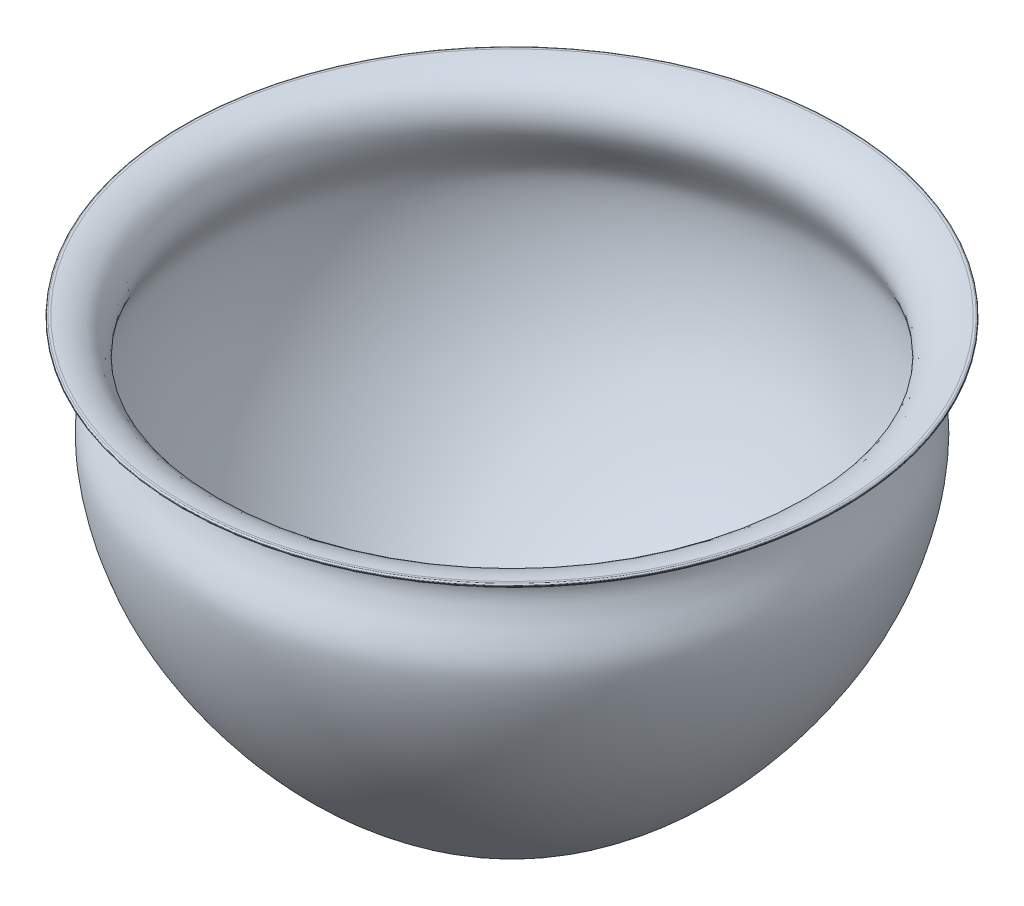
ISO-10303-21;
HEADER;
FILE_DESCRIPTION(('STEP AP214'),'2;1');
FILE_NAME('part.step','',(''),(''),'','','');
FILE_SCHEMA(('AUTOMOTIVE_DESIGN { 1 0 10303 214 1 1 1 1 }'));
ENDSEC;
DATA;
#1=APPLICATION_CONTEXT('core data for automotive mechanical design processes');
#2=APPLICATION_PROTOCOL_DEFINITION('international standard','automotive_design',2000,#1);
#3=PRODUCT_CONTEXT('',#1,'mechanical');
#4=PRODUCT('Part','Part','',(#3));
#5=PRODUCT_RELATED_PRODUCT_CATEGORY('part','',(#4));
#6=PRODUCT_DEFINITION_FORMATION('','',#4);
#7=PRODUCT_DEFINITION_CONTEXT('part definition',#1,'design');
#8=PRODUCT_DEFINITION('design','',#6,#7);
#9=PRODUCT_DEFINITION_SHAPE('','',#8);
#10=(LENGTH_UNIT() NAMED_UNIT(*) SI_UNIT(.MILLI.,.METRE.));
#11=(NAMED_UNIT(*) PLANE_ANGLE_UNIT() SI_UNIT($,.RADIAN.));
#12=(NAMED_UNIT(*) SI_UNIT($,.STERADIAN.) SOLID_ANGLE_UNIT());
#13=UNCERTAINTY_MEASURE_WITH_UNIT(LENGTH_MEASURE(1.E-05),#10,'distance_accuracy_value','');
#14=(GEOMETRIC_REPRESENTATION_CONTEXT(3) GLOBAL_UNCERTAINTY_ASSIGNED_CONTEXT((#13)) GLOBAL_UNIT_ASSIGNED_CONTEXT((#10,
#11,#12)) REPRESENTATION_CONTEXT('',''));
#15=CARTESIAN_POINT('',(0.,0.,0.));
#16=DIRECTION('',(0.,0.,1.));
#17=DIRECTION('',(1.,0.,0.));
#18=AXIS2_PLACEMENT_3D('',#15,#16,#17);
#19=CARTESIAN_POINT('',(0.,138.146661076661,0.));
#20=DIRECTION('',(0.,1.,0.));
#21=DIRECTION('',(0.,0.,1.));
#22=AXIS2_PLACEMENT_3D('',#19,#20,#21);
#23=CYLINDRICAL_SURFACE('',#22,196.85);
#24=CARTESIAN_POINT('',(0.,111.576447321761,0.));
#25=DIRECTION('',(0.,1.,0.));
#26=DIRECTION('',(0.,0.,1.));
#27=AXIS2_PLACEMENT_3D('',#24,#25,#26);
#28=CIRCLE('',#27,196.85);
#29=CARTESIAN_POINT('',(0.,111.576447321761,196.85));
#30=VERTEX_POINT('',#29);
#31=EDGE_CURVE('E46',#30,#30,#28,.F.);
#32=ORIENTED_EDGE('',*,*,#31,.T.);
#33=EDGE_LOOP('',(#32));
#34=FACE_BOUND('',#33,.T.);
#35=CARTESIAN_POINT('',(0.,111.140228763594,0.));
#36=DIRECTION('',(0.,-1.,0.));
#37=DIRECTION('',(0.,0.,-1.));
#38=AXIS2_PLACEMENT_3D('',#35,#36,#37);
#39=CIRCLE('',#38,196.85);
#40=CARTESIAN_POINT('',(0.,111.140228763594,-196.85));
#41=VERTEX_POINT('',#40);
#42=EDGE_CURVE('E65',#41,#41,#39,.F.);
#43=ORIENTED_EDGE('',*,*,#42,.T.);
#44=EDGE_LOOP('',(#43));
#45=FACE_BOUND('',#44,.T.);
#46=ADVANCED_FACE('F38',(#34,#45),#23,.T.);
#47=CARTESIAN_POINT('',(0.,-143.614848438275,0.));
#48=CARTESIAN_POINT('',(21.0971627650414,-140.489982108079,0.));
#49=CARTESIAN_POINT('',(43.4174952237635,-131.902226145701,0.));
#50=CARTESIAN_POINT('',(79.0427894721283,-114.56950834996,0.));
#51=CARTESIAN_POINT('',(126.381390764073,-82.0902923005602,0.));
#52=CARTESIAN_POINT('',(177.530344664379,-0.3786149871063,0.));
#53=CARTESIAN_POINT('',(185.62552597227,41.1500484715199,0.));
#54=CARTESIAN_POINT('',(183.542572674097,65.7283344527933,0.));
#55=CARTESIAN_POINT('',(172.92728850049,79.9153604561637,0.));
#56=CARTESIAN_POINT('',(170.470470340914,94.0859498378865,0.));
#57=CARTESIAN_POINT('',(173.918700457603,100.915670939568,0.));
#58=CARTESIAN_POINT('',(179.35004516971,106.430566750144,0.));
#59=CARTESIAN_POINT('',(187.548809654196,110.385151561725,0.));
#60=CARTESIAN_POINT('',(196.850000000001,110.385151561725,0.));
#61=B_SPLINE_CURVE_WITH_KNOTS('',3,(#47,#48,#49,#50,#51,#52,#53,#54,#55,#56,#57,#58,#59,#60),
.UNSPECIFIED.,.F.,.F.,(4,1,1,1,1,1,1,1,1,1,1,4),(0.,0.202766542285404,0.25723093438916,
0.512709144743295,0.564296737367283,0.721519268005055,0.753273893585161,0.850088367588239,
0.870113552190853,0.933500555008694,0.947281537324831,1.),.UNSPECIFIED.);
#62=CARTESIAN_POINT('',(0.,138.146661076661,0.));
#63=DIRECTION('',(0.,1.,0.));
#64=AXIS1_PLACEMENT('',#62,#63);
#65=SURFACE_OF_REVOLUTION('',#61,#64);
#66=CARTESIAN_POINT('',(0.,110.378355181591,0.));
#67=DIRECTION('',(0.,1.,0.));
#68=DIRECTION('',(0.,0.,1.));
#69=AXIS2_PLACEMENT_3D('',#66,#67,#68);
#70=CIRCLE('',#69,196.101879663027);
#71=CARTESIAN_POINT('',(0.,110.378355181591,196.101879663027));
#72=VERTEX_POINT('',#71);
#73=EDGE_CURVE('E11',#72,#72,#70,.F.);
#74=ORIENTED_EDGE('',*,*,#73,.T.);
#75=EDGE_LOOP('',(#74));
#76=FACE_BOUND('',#75,.T.);
#77=CARTESIAN_POINT('',(0.,-143.614848438275,0.));
#78=VERTEX_POINT('',#77);
#79=VERTEX_LOOP('',#78);
#80=FACE_BOUND('',#79,.T.);
#81=ADVANCED_FACE('F84',(#76,#80),#65,.T.);
#82=CARTESIAN_POINT('',(-228.068784606316,112.338447321761,0.));
#83=DIRECTION('',(0.,1.,0.));
#84=DIRECTION('',(0.,0.,1.));
#85=AXIS2_PLACEMENT_3D('',#82,#83,#84);
#86=PLANE('',#85);
#87=CARTESIAN_POINT('',(0.,112.338447321761,0.));
#88=DIRECTION('',(0.,1.,0.));
#89=DIRECTION('',(0.,0.,1.));
#90=AXIS2_PLACEMENT_3D('',#87,#88,#89);
#91=CIRCLE('',#90,196.088);
#92=CARTESIAN_POINT('',(0.,112.338447321761,196.088));
#93=VERTEX_POINT('',#92);
#94=EDGE_CURVE('E62',#93,#93,#91,.T.);
#95=ORIENTED_EDGE('',*,*,#94,.T.);
#96=EDGE_LOOP('',(#95));
#97=FACE_BOUND('',#96,.T.);
#98=CARTESIAN_POINT('',(0.,112.338447321761,0.));
#99=DIRECTION('',(0.,1.,0.));
#100=DIRECTION('',(0.,0.,1.));
#101=AXIS2_PLACEMENT_3D('',#98,#99,#100);
#102=CIRCLE('',#101,194.850004);
#103=CARTESIAN_POINT('',(0.,112.338447321761,194.850004));
#104=VERTEX_POINT('',#103);
#105=EDGE_CURVE('E60',#104,#104,#102,.T.);
#106=ORIENTED_EDGE('',*,*,#105,.F.);
#107=EDGE_LOOP('',(#106));
#108=FACE_BOUND('',#107,.T.);
#109=ADVANCED_FACE('F56',(#97,#108),#86,.T.);
#110=CARTESIAN_POINT('',(0.296618507002795,-143.570639565105,0.));
#111=CARTESIAN_POINT('',(21.2621441453272,-140.426480597248,0.));
#112=CARTESIAN_POINT('',(43.4835759552826,-131.870075992409,0.));
#113=CARTESIAN_POINT('',(79.0427894721283,-114.56950834996,0.));
#114=CARTESIAN_POINT('',(126.381390764073,-82.0902923005602,0.));
#115=CARTESIAN_POINT('',(177.530344664379,-0.3786149871063,0.));
#116=CARTESIAN_POINT('',(185.62552597227,41.1500484715199,0.));
#117=CARTESIAN_POINT('',(183.542572674097,65.7283344527933,0.));
#118=CARTESIAN_POINT('',(172.92728850049,79.9153604561637,0.));
#119=CARTESIAN_POINT('',(170.470470340914,94.0859498378865,0.));
#120=CARTESIAN_POINT('',(173.918700457603,100.915670939568,0.));
#121=CARTESIAN_POINT('',(179.35004516971,106.430566750144,0.));
#122=CARTESIAN_POINT('',(187.548809654196,110.385151561725,0.));
#123=CARTESIAN_POINT('',(196.850000000001,110.385151561725,0.));
#124=B_SPLINE_CURVE_WITH_KNOTS('',3,(#110,#111,#112,#113,#114,#115,#116,#117,#118,#119,#120,
#121,#122,#123),.UNSPECIFIED.,.F.,.F.,(4,1,1,1,1,1,1,1,1,1,1,4),(0.00095101517211267,
0.202766542285404,0.25723093438916,0.512709144743295,0.564296737367283,0.721519268005055,
0.753273893585161,0.850088367588239,0.870113552190853,0.933500555008694,0.947281537324831,1.),.UNSPECIFIED.);
#125=CARTESIAN_POINT('',(0.,138.146661076661,0.));
#126=DIRECTION('',(0.,1.,0.));
#127=AXIS1_PLACEMENT('',#125,#126);
#128=SURFACE_OF_REVOLUTION('',#124,#127);
#129=OFFSET_SURFACE('',#128,-1.999996,.F.);
#130=CARTESIAN_POINT('',(0.,-141.592761545276,0.));
#131=VERTEX_POINT('',#130);
#132=VERTEX_LOOP('',#131);
#133=FACE_BOUND('',#132,.T.);
#134=ORIENTED_EDGE('',*,*,#105,.T.);
#135=EDGE_LOOP('',(#134));
#136=FACE_BOUND('',#135,.T.);
#137=ADVANCED_FACE('F52',(#133,#136),#129,.F.);
#138=CARTESIAN_POINT('',(0.,111.576447321761,0.));
#139=DIRECTION('',(0.,1.,0.));
#140=DIRECTION('',(0.,0.,1.));
#141=AXIS2_PLACEMENT_3D('',#138,#139,#140);
#142=TOROIDAL_SURFACE('',#141,196.088,0.762);
#143=ORIENTED_EDGE('',*,*,#31,.F.);
#144=EDGE_LOOP('',(#143));
#145=FACE_BOUND('',#144,.T.);
#146=ORIENTED_EDGE('',*,*,#94,.F.);
#147=EDGE_LOOP('',(#146));
#148=FACE_BOUND('',#147,.T.);
#149=ADVANCED_FACE('F55',(#145,#148),#142,.T.);
#150=CARTESIAN_POINT('',(0.,111.140228763594,0.));
#151=DIRECTION('',(0.,-1.,0.));
#152=DIRECTION('',(0.,0.,-1.));
#153=AXIS2_PLACEMENT_3D('',#150,#151,#152);
#154=TOROIDAL_SURFACE('',#153,196.088,0.762);
#155=ORIENTED_EDGE('',*,*,#73,.F.);
#156=EDGE_LOOP('',(#155));
#157=FACE_BOUND('',#156,.T.);
#158=ORIENTED_EDGE('',*,*,#42,.F.);
#159=EDGE_LOOP('',(#158));
#160=FACE_BOUND('',#159,.T.);
#161=ADVANCED_FACE('F40',(#157,#160),#154,.T.);
#162=CLOSED_SHELL('',(#46,#81,#109,#137,#149,#161));
#163=MANIFOLD_SOLID_BREP('B2',#162);
#164=ADVANCED_BREP_SHAPE_REPRESENTATION('',(#18,#163),#14);
#165=SHAPE_DEFINITION_REPRESENTATION(#9,#164);
ENDSEC;
END-ISO-10303-21;
